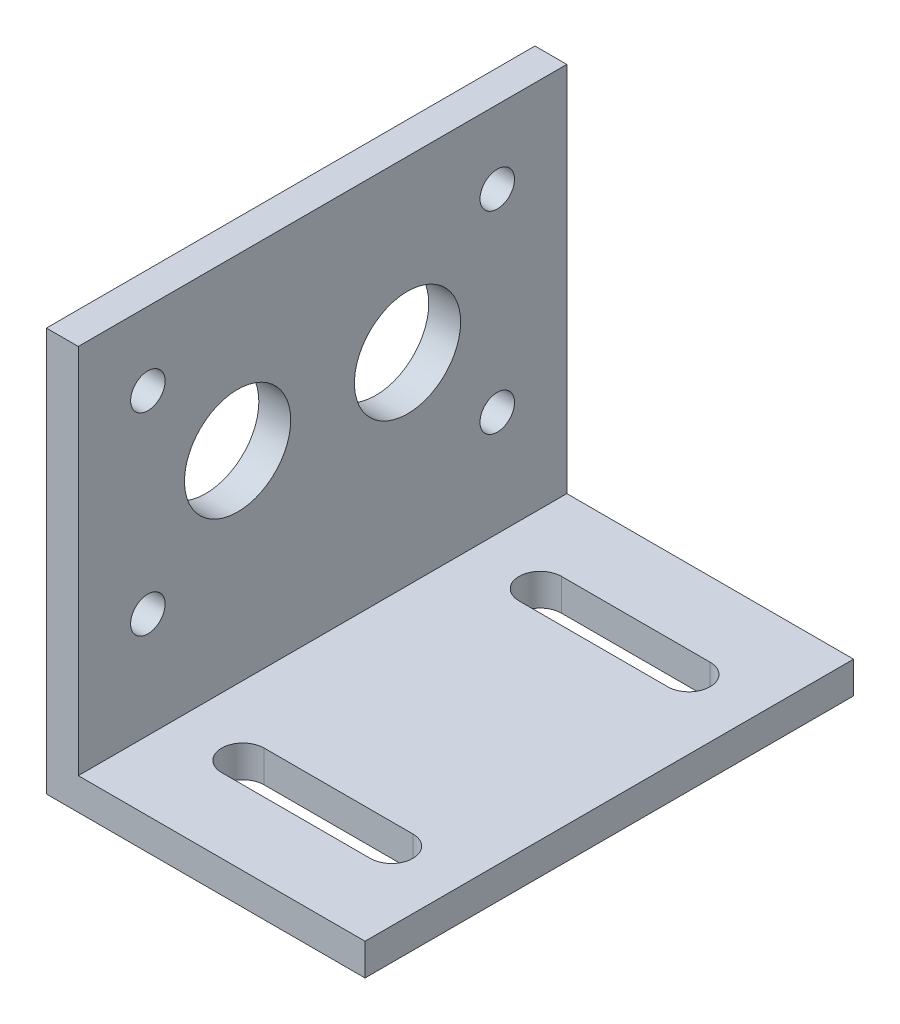
ISO-10303-21;
HEADER;
FILE_DESCRIPTION(('STEP AP214'),'2;1');
FILE_NAME('part.step','',(''),(''),'','','');
FILE_SCHEMA(('AUTOMOTIVE_DESIGN { 1 0 10303 214 1 1 1 1 }'));
ENDSEC;
DATA;
#1=APPLICATION_CONTEXT('core data for automotive mechanical design processes');
#2=APPLICATION_PROTOCOL_DEFINITION('international standard','automotive_design',2000,#1);
#3=PRODUCT_CONTEXT('',#1,'mechanical');
#4=PRODUCT('Part','Part','',(#3));
#5=PRODUCT_RELATED_PRODUCT_CATEGORY('part','',(#4));
#6=PRODUCT_DEFINITION_FORMATION('','',#4);
#7=PRODUCT_DEFINITION_CONTEXT('part definition',#1,'design');
#8=PRODUCT_DEFINITION('design','',#6,#7);
#9=PRODUCT_DEFINITION_SHAPE('','',#8);
#10=(LENGTH_UNIT() NAMED_UNIT(*) SI_UNIT(.MILLI.,.METRE.));
#11=(NAMED_UNIT(*) PLANE_ANGLE_UNIT() SI_UNIT($,.RADIAN.));
#12=(NAMED_UNIT(*) SI_UNIT($,.STERADIAN.) SOLID_ANGLE_UNIT());
#13=UNCERTAINTY_MEASURE_WITH_UNIT(LENGTH_MEASURE(1.E-05),#10,'distance_accuracy_value','');
#14=(GEOMETRIC_REPRESENTATION_CONTEXT(3) GLOBAL_UNCERTAINTY_ASSIGNED_CONTEXT((#13)) GLOBAL_UNIT_ASSIGNED_CONTEXT((#10,
#11,#12)) REPRESENTATION_CONTEXT('',''));
#15=CARTESIAN_POINT('',(0.,0.,0.));
#16=DIRECTION('',(0.,0.,1.));
#17=DIRECTION('',(1.,0.,0.));
#18=AXIS2_PLACEMENT_3D('',#15,#16,#17);
#19=CARTESIAN_POINT('',(-27.,3.,23.));
#20=DIRECTION('',(-1.,0.,0.));
#21=DIRECTION('',(0.,0.,1.));
#22=AXIS2_PLACEMENT_3D('',#19,#20,#21);
#23=PLANE('',#22);
#24=CARTESIAN_POINT('',(-27.,12.91,16.45));
#25=DIRECTION('',(1.,0.,0.));
#26=DIRECTION('',(0.,0.,-1.));
#27=AXIS2_PLACEMENT_3D('',#24,#25,#26);
#28=CIRCLE('',#27,1.625);
#29=CARTESIAN_POINT('',(-27.,12.91,14.825));
#30=VERTEX_POINT('',#29);
#31=EDGE_CURVE('E396',#30,#30,#28,.T.);
#32=ORIENTED_EDGE('',*,*,#31,.F.);
#33=EDGE_LOOP('',(#32));
#34=FACE_BOUND('',#33,.T.);
#35=CARTESIAN_POINT('',(-27.,22.,-8.));
#36=DIRECTION('',(1.,0.,0.));
#37=DIRECTION('',(0.,0.,-1.));
#38=AXIS2_PLACEMENT_3D('',#35,#36,#37);
#39=CIRCLE('',#38,5.);
#40=CARTESIAN_POINT('',(-27.,22.,-13.));
#41=VERTEX_POINT('',#40);
#42=EDGE_CURVE('E402',#41,#41,#39,.T.);
#43=ORIENTED_EDGE('',*,*,#42,.F.);
#44=EDGE_LOOP('',(#43));
#45=FACE_BOUND('',#44,.T.);
#46=CARTESIAN_POINT('',(-27.,31.11,16.45));
#47=DIRECTION('',(1.,0.,0.));
#48=DIRECTION('',(0.,0.,-1.));
#49=AXIS2_PLACEMENT_3D('',#46,#47,#48);
#50=CIRCLE('',#49,1.625);
#51=CARTESIAN_POINT('',(-27.,31.11,14.825));
#52=VERTEX_POINT('',#51);
#53=EDGE_CURVE('E168',#52,#52,#50,.T.);
#54=ORIENTED_EDGE('',*,*,#53,.F.);
#55=EDGE_LOOP('',(#54));
#56=FACE_BOUND('',#55,.T.);
#57=DIRECTION('',(0.,1.,0.));
#58=VECTOR('',#57,1.);
#59=CARTESIAN_POINT('',(-27.,3.,-23.));
#60=LINE('',#59,#58);
#61=CARTESIAN_POINT('',(-27.,3.,-23.));
#62=VERTEX_POINT('',#61);
#63=CARTESIAN_POINT('',(-27.,38.,-23.));
#64=VERTEX_POINT('',#63);
#65=EDGE_CURVE('E234',#62,#64,#60,.T.);
#66=ORIENTED_EDGE('',*,*,#65,.T.);
#67=DIRECTION('',(0.,0.,-1.));
#68=VECTOR('',#67,1.);
#69=CARTESIAN_POINT('',(-27.,38.,23.));
#70=LINE('',#69,#68);
#71=CARTESIAN_POINT('',(-27.,38.,23.));
#72=VERTEX_POINT('',#71);
#73=EDGE_CURVE('E249',#72,#64,#70,.T.);
#74=ORIENTED_EDGE('',*,*,#73,.F.);
#75=DIRECTION('',(0.,1.,0.));
#76=VECTOR('',#75,1.);
#77=CARTESIAN_POINT('',(-27.,3.,23.));
#78=LINE('',#77,#76);
#79=CARTESIAN_POINT('',(-27.,3.,23.));
#80=VERTEX_POINT('',#79);
#81=EDGE_CURVE('E221',#80,#72,#78,.T.);
#82=ORIENTED_EDGE('',*,*,#81,.F.);
#83=DIRECTION('',(0.,0.,-1.));
#84=VECTOR('',#83,1.);
#85=CARTESIAN_POINT('',(-27.,3.,23.));
#86=LINE('',#85,#84);
#87=EDGE_CURVE('E48',#80,#62,#86,.T.);
#88=ORIENTED_EDGE('',*,*,#87,.T.);
#89=EDGE_LOOP('',(#66,#74,#82,#88));
#90=FACE_BOUND('',#89,.T.);
#91=CARTESIAN_POINT('',(-27.,12.91,-16.45));
#92=DIRECTION('',(1.,0.,0.));
#93=DIRECTION('',(0.,0.,-1.));
#94=AXIS2_PLACEMENT_3D('',#91,#92,#93);
#95=CIRCLE('',#94,1.625);
#96=CARTESIAN_POINT('',(-27.,12.91,-18.075));
#97=VERTEX_POINT('',#96);
#98=EDGE_CURVE('E382',#97,#97,#95,.F.);
#99=ORIENTED_EDGE('',*,*,#98,.T.);
#100=EDGE_LOOP('',(#99));
#101=FACE_BOUND('',#100,.T.);
#102=CARTESIAN_POINT('',(-27.,31.11,-16.45));
#103=DIRECTION('',(1.,0.,0.));
#104=DIRECTION('',(0.,0.,-1.));
#105=AXIS2_PLACEMENT_3D('',#102,#103,#104);
#106=CIRCLE('',#105,1.625);
#107=CARTESIAN_POINT('',(-27.,31.11,-18.075));
#108=VERTEX_POINT('',#107);
#109=EDGE_CURVE('E384',#108,#108,#106,.F.);
#110=ORIENTED_EDGE('',*,*,#109,.T.);
#111=EDGE_LOOP('',(#110));
#112=FACE_BOUND('',#111,.T.);
#113=CARTESIAN_POINT('',(-27.,22.,8.));
#114=DIRECTION('',(1.,0.,0.));
#115=DIRECTION('',(0.,0.,-1.));
#116=AXIS2_PLACEMENT_3D('',#113,#114,#115);
#117=CIRCLE('',#116,5.);
#118=CARTESIAN_POINT('',(-27.,22.,3.));
#119=VERTEX_POINT('',#118);
#120=EDGE_CURVE('E390',#119,#119,#117,.F.);
#121=ORIENTED_EDGE('',*,*,#120,.T.);
#122=EDGE_LOOP('',(#121));
#123=FACE_BOUND('',#122,.T.);
#124=ADVANCED_FACE('F40',(#34,#45,#56,#90,#101,#112,#123),#23,.F.);
#125=CARTESIAN_POINT('',(-30.,0.,23.));
#126=DIRECTION('',(1.,0.,0.));
#127=DIRECTION('',(0.,0.,-1.));
#128=AXIS2_PLACEMENT_3D('',#125,#126,#127);
#129=PLANE('',#128);
#130=CARTESIAN_POINT('',(-30.,12.91,16.45));
#131=DIRECTION('',(1.,0.,0.));
#132=DIRECTION('',(0.,0.,-1.));
#133=AXIS2_PLACEMENT_3D('',#130,#131,#132);
#134=CIRCLE('',#133,1.625);
#135=CARTESIAN_POINT('',(-30.,12.91,14.825));
#136=VERTEX_POINT('',#135);
#137=EDGE_CURVE('E393',#136,#136,#134,.T.);
#138=ORIENTED_EDGE('',*,*,#137,.T.);
#139=EDGE_LOOP('',(#138));
#140=FACE_BOUND('',#139,.T.);
#141=CARTESIAN_POINT('',(-30.,22.,-8.));
#142=DIRECTION('',(1.,0.,0.));
#143=DIRECTION('',(0.,0.,-1.));
#144=AXIS2_PLACEMENT_3D('',#141,#142,#143);
#145=CIRCLE('',#144,5.);
#146=CARTESIAN_POINT('',(-30.,22.,-13.));
#147=VERTEX_POINT('',#146);
#148=EDGE_CURVE('E399',#147,#147,#145,.T.);
#149=ORIENTED_EDGE('',*,*,#148,.T.);
#150=EDGE_LOOP('',(#149));
#151=FACE_BOUND('',#150,.T.);
#152=CARTESIAN_POINT('',(-30.,31.11,16.45));
#153=DIRECTION('',(1.,0.,0.));
#154=DIRECTION('',(0.,0.,-1.));
#155=AXIS2_PLACEMENT_3D('',#152,#153,#154);
#156=CIRCLE('',#155,1.625);
#157=CARTESIAN_POINT('',(-30.,31.11,14.825));
#158=VERTEX_POINT('',#157);
#159=EDGE_CURVE('E193',#158,#158,#156,.T.);
#160=ORIENTED_EDGE('',*,*,#159,.T.);
#161=EDGE_LOOP('',(#160));
#162=FACE_BOUND('',#161,.T.);
#163=DIRECTION('',(0.,-1.,0.));
#164=VECTOR('',#163,1.);
#165=CARTESIAN_POINT('',(-30.,0.,-23.));
#166=LINE('',#165,#164);
#167=CARTESIAN_POINT('',(-30.,38.,-23.));
#168=VERTEX_POINT('',#167);
#169=CARTESIAN_POINT('',(-30.,0.,-23.));
#170=VERTEX_POINT('',#169);
#171=EDGE_CURVE('E238',#168,#170,#166,.T.);
#172=ORIENTED_EDGE('',*,*,#171,.T.);
#173=DIRECTION('',(0.,0.,-1.));
#174=VECTOR('',#173,1.);
#175=CARTESIAN_POINT('',(-30.,0.,23.));
#176=LINE('',#175,#174);
#177=CARTESIAN_POINT('',(-30.,0.,23.));
#178=VERTEX_POINT('',#177);
#179=EDGE_CURVE('E243',#178,#170,#176,.T.);
#180=ORIENTED_EDGE('',*,*,#179,.F.);
#181=DIRECTION('',(0.,-1.,0.));
#182=VECTOR('',#181,1.);
#183=CARTESIAN_POINT('',(-30.,0.,23.));
#184=LINE('',#183,#182);
#185=CARTESIAN_POINT('',(-30.,38.,23.));
#186=VERTEX_POINT('',#185);
#187=EDGE_CURVE('E225',#186,#178,#184,.T.);
#188=ORIENTED_EDGE('',*,*,#187,.F.);
#189=DIRECTION('',(0.,0.,-1.));
#190=VECTOR('',#189,1.);
#191=CARTESIAN_POINT('',(-30.,38.,23.));
#192=LINE('',#191,#190);
#193=EDGE_CURVE('E246',#186,#168,#192,.T.);
#194=ORIENTED_EDGE('',*,*,#193,.T.);
#195=EDGE_LOOP('',(#172,#180,#188,#194));
#196=FACE_BOUND('',#195,.T.);
#197=CARTESIAN_POINT('',(-30.,12.91,-16.45));
#198=DIRECTION('',(1.,0.,0.));
#199=DIRECTION('',(0.,0.,-1.));
#200=AXIS2_PLACEMENT_3D('',#197,#198,#199);
#201=CIRCLE('',#200,1.625);
#202=CARTESIAN_POINT('',(-30.,12.91,-18.075));
#203=VERTEX_POINT('',#202);
#204=EDGE_CURVE('E379',#203,#203,#201,.F.);
#205=ORIENTED_EDGE('',*,*,#204,.F.);
#206=EDGE_LOOP('',(#205));
#207=FACE_BOUND('',#206,.T.);
#208=CARTESIAN_POINT('',(-30.,31.11,-16.45));
#209=DIRECTION('',(1.,0.,0.));
#210=DIRECTION('',(0.,0.,-1.));
#211=AXIS2_PLACEMENT_3D('',#208,#209,#210);
#212=CIRCLE('',#211,1.625);
#213=CARTESIAN_POINT('',(-30.,31.11,-18.075));
#214=VERTEX_POINT('',#213);
#215=EDGE_CURVE('E405',#214,#214,#212,.F.);
#216=ORIENTED_EDGE('',*,*,#215,.F.);
#217=EDGE_LOOP('',(#216));
#218=FACE_BOUND('',#217,.T.);
#219=CARTESIAN_POINT('',(-30.,22.,8.));
#220=DIRECTION('',(1.,0.,0.));
#221=DIRECTION('',(0.,0.,-1.));
#222=AXIS2_PLACEMENT_3D('',#219,#220,#221);
#223=CIRCLE('',#222,5.);
#224=CARTESIAN_POINT('',(-30.,22.,3.));
#225=VERTEX_POINT('',#224);
#226=EDGE_CURVE('E387',#225,#225,#223,.F.);
#227=ORIENTED_EDGE('',*,*,#226,.F.);
#228=EDGE_LOOP('',(#227));
#229=FACE_BOUND('',#228,.T.);
#230=ADVANCED_FACE('F271',(#140,#151,#162,#196,#207,#218,#229),#129,.F.);
#231=CARTESIAN_POINT('',(0.,0.,23.));
#232=DIRECTION('',(-1.,0.,0.));
#233=DIRECTION('',(0.,0.,1.));
#234=AXIS2_PLACEMENT_3D('',#231,#232,#233);
#235=PLANE('',#234);
#236=DIRECTION('',(0.,1.,0.));
#237=VECTOR('',#236,1.);
#238=CARTESIAN_POINT('',(0.,0.,-23.));
#239=LINE('',#238,#237);
#240=CARTESIAN_POINT('',(0.,0.,-23.));
#241=VERTEX_POINT('',#240);
#242=CARTESIAN_POINT('',(0.,3.,-23.));
#243=VERTEX_POINT('',#242);
#244=EDGE_CURVE('E180',#241,#243,#239,.T.);
#245=ORIENTED_EDGE('',*,*,#244,.T.);
#246=DIRECTION('',(0.,0.,-1.));
#247=VECTOR('',#246,1.);
#248=CARTESIAN_POINT('',(0.,3.,23.));
#249=LINE('',#248,#247);
#250=CARTESIAN_POINT('',(0.,3.,23.));
#251=VERTEX_POINT('',#250);
#252=EDGE_CURVE('E11',#251,#243,#249,.T.);
#253=ORIENTED_EDGE('',*,*,#252,.F.);
#254=DIRECTION('',(0.,1.,0.));
#255=VECTOR('',#254,1.);
#256=CARTESIAN_POINT('',(0.,0.,23.));
#257=LINE('',#256,#255);
#258=CARTESIAN_POINT('',(0.,0.,23.));
#259=VERTEX_POINT('',#258);
#260=EDGE_CURVE('E215',#259,#251,#257,.T.);
#261=ORIENTED_EDGE('',*,*,#260,.F.);
#262=DIRECTION('',(0.,0.,-1.));
#263=VECTOR('',#262,1.);
#264=CARTESIAN_POINT('',(0.,0.,23.));
#265=LINE('',#264,#263);
#266=EDGE_CURVE('E229',#259,#241,#265,.T.);
#267=ORIENTED_EDGE('',*,*,#266,.T.);
#268=EDGE_LOOP('',(#245,#253,#261,#267));
#269=FACE_BOUND('',#268,.T.);
#270=ADVANCED_FACE('F42',(#269),#235,.F.);
#271=CARTESIAN_POINT('',(0.,3.,23.));
#272=DIRECTION('',(0.,-1.,0.));
#273=DIRECTION('',(0.,0.,-1.));
#274=AXIS2_PLACEMENT_3D('',#271,#272,#273);
#275=PLANE('',#274);
#276=DIRECTION('',(-1.,0.,0.));
#277=VECTOR('',#276,1.);
#278=CARTESIAN_POINT('',(-6.5,3.,12.));
#279=LINE('',#278,#277);
#280=CARTESIAN_POINT('',(-6.5,3.,12.));
#281=VERTEX_POINT('',#280);
#282=CARTESIAN_POINT('',(-20.5,3.,12.));
#283=VERTEX_POINT('',#282);
#284=EDGE_CURVE('E174',#281,#283,#279,.T.);
#285=ORIENTED_EDGE('',*,*,#284,.F.);
#286=CARTESIAN_POINT('',(-6.5,3.,14.));
#287=DIRECTION('',(0.,1.,0.));
#288=DIRECTION('',(0.,0.,1.));
#289=AXIS2_PLACEMENT_3D('',#286,#287,#288);
#290=CIRCLE('',#289,2.);
#291=CARTESIAN_POINT('',(-6.5,3.,16.));
#292=VERTEX_POINT('',#291);
#293=EDGE_CURVE('E55',#292,#281,#290,.T.);
#294=ORIENTED_EDGE('',*,*,#293,.F.);
#295=DIRECTION('',(1.,0.,0.));
#296=VECTOR('',#295,1.);
#297=CARTESIAN_POINT('',(-6.5,3.,16.));
#298=LINE('',#297,#296);
#299=CARTESIAN_POINT('',(-20.5,3.,16.));
#300=VERTEX_POINT('',#299);
#301=EDGE_CURVE('E162',#300,#292,#298,.T.);
#302=ORIENTED_EDGE('',*,*,#301,.F.);
#303=CARTESIAN_POINT('',(-20.5,3.,14.));
#304=DIRECTION('',(0.,1.,0.));
#305=DIRECTION('',(0.,0.,1.));
#306=AXIS2_PLACEMENT_3D('',#303,#304,#305);
#307=CIRCLE('',#306,2.);
#308=EDGE_CURVE('E165',#283,#300,#307,.T.);
#309=ORIENTED_EDGE('',*,*,#308,.F.);
#310=EDGE_LOOP('',(#285,#294,#302,#309));
#311=FACE_BOUND('',#310,.T.);
#312=DIRECTION('',(-1.,0.,0.));
#313=VECTOR('',#312,1.);
#314=CARTESIAN_POINT('',(-6.5,3.,-16.));
#315=LINE('',#314,#313);
#316=CARTESIAN_POINT('',(-6.5,3.,-16.));
#317=VERTEX_POINT('',#316);
#318=CARTESIAN_POINT('',(-20.5,3.,-16.));
#319=VERTEX_POINT('',#318);
#320=EDGE_CURVE('E201',#317,#319,#315,.T.);
#321=ORIENTED_EDGE('',*,*,#320,.F.);
#322=CARTESIAN_POINT('',(-6.5,3.,-14.));
#323=DIRECTION('',(0.,1.,0.));
#324=DIRECTION('',(0.,0.,-1.));
#325=AXIS2_PLACEMENT_3D('',#322,#323,#324);
#326=CIRCLE('',#325,2.);
#327=CARTESIAN_POINT('',(-6.5,3.,-12.));
#328=VERTEX_POINT('',#327);
#329=EDGE_CURVE('E63',#328,#317,#326,.T.);
#330=ORIENTED_EDGE('',*,*,#329,.F.);
#331=DIRECTION('',(1.,0.,0.));
#332=VECTOR('',#331,1.);
#333=CARTESIAN_POINT('',(-6.5,3.,-12.));
#334=LINE('',#333,#332);
#335=CARTESIAN_POINT('',(-20.5,3.,-12.));
#336=VERTEX_POINT('',#335);
#337=EDGE_CURVE('E194',#336,#328,#334,.T.);
#338=ORIENTED_EDGE('',*,*,#337,.F.);
#339=CARTESIAN_POINT('',(-20.5,3.,-14.));
#340=DIRECTION('',(0.,1.,0.));
#341=DIRECTION('',(0.,0.,-1.));
#342=AXIS2_PLACEMENT_3D('',#339,#340,#341);
#343=CIRCLE('',#342,2.);
#344=EDGE_CURVE('E197',#319,#336,#343,.T.);
#345=ORIENTED_EDGE('',*,*,#344,.F.);
#346=EDGE_LOOP('',(#321,#330,#338,#345));
#347=FACE_BOUND('',#346,.T.);
#348=DIRECTION('',(-1.,0.,0.));
#349=VECTOR('',#348,1.);
#350=CARTESIAN_POINT('',(0.,3.,-23.));
#351=LINE('',#350,#349);
#352=EDGE_CURVE('E232',#243,#62,#351,.T.);
#353=ORIENTED_EDGE('',*,*,#352,.T.);
#354=ORIENTED_EDGE('',*,*,#87,.F.);
#355=DIRECTION('',(-1.,0.,0.));
#356=VECTOR('',#355,1.);
#357=CARTESIAN_POINT('',(0.,3.,23.));
#358=LINE('',#357,#356);
#359=EDGE_CURVE('E218',#251,#80,#358,.T.);
#360=ORIENTED_EDGE('',*,*,#359,.F.);
#361=ORIENTED_EDGE('',*,*,#252,.T.);
#362=EDGE_LOOP('',(#353,#354,#360,#361));
#363=FACE_BOUND('',#362,.T.);
#364=ADVANCED_FACE('F280',(#311,#347,#363),#275,.F.);
#365=CARTESIAN_POINT('',(-30.,38.,23.));
#366=DIRECTION('',(0.,-1.,0.));
#367=DIRECTION('',(0.,0.,-1.));
#368=AXIS2_PLACEMENT_3D('',#365,#366,#367);
#369=PLANE('',#368);
#370=DIRECTION('',(-1.,0.,0.));
#371=VECTOR('',#370,1.);
#372=CARTESIAN_POINT('',(-30.,38.,-23.));
#373=LINE('',#372,#371);
#374=EDGE_CURVE('E236',#64,#168,#373,.T.);
#375=ORIENTED_EDGE('',*,*,#374,.T.);
#376=ORIENTED_EDGE('',*,*,#193,.F.);
#377=DIRECTION('',(-1.,0.,0.));
#378=VECTOR('',#377,1.);
#379=CARTESIAN_POINT('',(-30.,38.,23.));
#380=LINE('',#379,#378);
#381=EDGE_CURVE('E223',#72,#186,#380,.T.);
#382=ORIENTED_EDGE('',*,*,#381,.F.);
#383=ORIENTED_EDGE('',*,*,#73,.T.);
#384=EDGE_LOOP('',(#375,#376,#382,#383));
#385=FACE_BOUND('',#384,.T.);
#386=ADVANCED_FACE('F267',(#385),#369,.F.);
#387=CARTESIAN_POINT('',(0.,0.,23.));
#388=DIRECTION('',(0.,1.,0.));
#389=DIRECTION('',(0.,0.,1.));
#390=AXIS2_PLACEMENT_3D('',#387,#388,#389);
#391=PLANE('',#390);
#392=DIRECTION('',(1.,0.,0.));
#393=VECTOR('',#392,1.);
#394=CARTESIAN_POINT('',(-6.5,0.,16.));
#395=LINE('',#394,#393);
#396=CARTESIAN_POINT('',(-20.5,0.,16.));
#397=VERTEX_POINT('',#396);
#398=CARTESIAN_POINT('',(-6.5,0.,16.));
#399=VERTEX_POINT('',#398);
#400=EDGE_CURVE('E149',#397,#399,#395,.T.);
#401=ORIENTED_EDGE('',*,*,#400,.T.);
#402=CARTESIAN_POINT('',(-6.5,0.,14.));
#403=DIRECTION('',(0.,1.,0.));
#404=DIRECTION('',(0.,0.,1.));
#405=AXIS2_PLACEMENT_3D('',#402,#403,#404);
#406=CIRCLE('',#405,2.);
#407=CARTESIAN_POINT('',(-6.5,0.,12.));
#408=VERTEX_POINT('',#407);
#409=EDGE_CURVE('E143',#399,#408,#406,.T.);
#410=ORIENTED_EDGE('',*,*,#409,.T.);
#411=DIRECTION('',(-1.,0.,0.));
#412=VECTOR('',#411,1.);
#413=CARTESIAN_POINT('',(-6.5,0.,12.));
#414=LINE('',#413,#412);
#415=CARTESIAN_POINT('',(-20.5,0.,12.));
#416=VERTEX_POINT('',#415);
#417=EDGE_CURVE('E153',#408,#416,#414,.T.);
#418=ORIENTED_EDGE('',*,*,#417,.T.);
#419=CARTESIAN_POINT('',(-20.5,0.,14.));
#420=DIRECTION('',(0.,1.,0.));
#421=DIRECTION('',(0.,0.,1.));
#422=AXIS2_PLACEMENT_3D('',#419,#420,#421);
#423=CIRCLE('',#422,2.);
#424=EDGE_CURVE('E157',#416,#397,#423,.T.);
#425=ORIENTED_EDGE('',*,*,#424,.T.);
#426=EDGE_LOOP('',(#401,#410,#418,#425));
#427=FACE_BOUND('',#426,.T.);
#428=DIRECTION('',(1.,0.,0.));
#429=VECTOR('',#428,1.);
#430=CARTESIAN_POINT('',(-6.5,0.,-12.));
#431=LINE('',#430,#429);
#432=CARTESIAN_POINT('',(-20.5,0.,-12.));
#433=VERTEX_POINT('',#432);
#434=CARTESIAN_POINT('',(-6.5,0.,-12.));
#435=VERTEX_POINT('',#434);
#436=EDGE_CURVE('E186',#433,#435,#431,.T.);
#437=ORIENTED_EDGE('',*,*,#436,.T.);
#438=CARTESIAN_POINT('',(-6.5,0.,-14.));
#439=DIRECTION('',(0.,1.,0.));
#440=DIRECTION('',(0.,0.,-1.));
#441=AXIS2_PLACEMENT_3D('',#438,#439,#440);
#442=CIRCLE('',#441,2.);
#443=CARTESIAN_POINT('',(-6.5,0.,-16.));
#444=VERTEX_POINT('',#443);
#445=EDGE_CURVE('E198',#435,#444,#442,.T.);
#446=ORIENTED_EDGE('',*,*,#445,.T.);
#447=DIRECTION('',(-1.,0.,0.));
#448=VECTOR('',#447,1.);
#449=CARTESIAN_POINT('',(-6.5,0.,-16.));
#450=LINE('',#449,#448);
#451=CARTESIAN_POINT('',(-20.5,0.,-16.));
#452=VERTEX_POINT('',#451);
#453=EDGE_CURVE('E210',#444,#452,#450,.T.);
#454=ORIENTED_EDGE('',*,*,#453,.T.);
#455=CARTESIAN_POINT('',(-20.5,0.,-14.));
#456=DIRECTION('',(0.,1.,0.));
#457=DIRECTION('',(0.,0.,-1.));
#458=AXIS2_PLACEMENT_3D('',#455,#456,#457);
#459=CIRCLE('',#458,2.);
#460=EDGE_CURVE('E207',#452,#433,#459,.T.);
#461=ORIENTED_EDGE('',*,*,#460,.T.);
#462=EDGE_LOOP('',(#437,#446,#454,#461));
#463=FACE_BOUND('',#462,.T.);
#464=DIRECTION('',(1.,0.,0.));
#465=VECTOR('',#464,1.);
#466=CARTESIAN_POINT('',(0.,0.,-23.));
#467=LINE('',#466,#465);
#468=EDGE_CURVE('E219',#170,#241,#467,.T.);
#469=ORIENTED_EDGE('',*,*,#468,.T.);
#470=ORIENTED_EDGE('',*,*,#266,.F.);
#471=DIRECTION('',(1.,0.,0.));
#472=VECTOR('',#471,1.);
#473=CARTESIAN_POINT('',(0.,0.,23.));
#474=LINE('',#473,#472);
#475=EDGE_CURVE('E227',#178,#259,#474,.T.);
#476=ORIENTED_EDGE('',*,*,#475,.F.);
#477=ORIENTED_EDGE('',*,*,#179,.T.);
#478=EDGE_LOOP('',(#469,#470,#476,#477));
#479=FACE_BOUND('',#478,.T.);
#480=ADVANCED_FACE('F159',(#427,#463,#479),#391,.F.);
#481=CARTESIAN_POINT('',(0.,0.,23.));
#482=DIRECTION('',(0.,0.,1.));
#483=DIRECTION('',(1.,0.,0.));
#484=AXIS2_PLACEMENT_3D('',#481,#482,#483);
#485=PLANE('',#484);
#486=ORIENTED_EDGE('',*,*,#260,.T.);
#487=ORIENTED_EDGE('',*,*,#359,.T.);
#488=ORIENTED_EDGE('',*,*,#81,.T.);
#489=ORIENTED_EDGE('',*,*,#381,.T.);
#490=ORIENTED_EDGE('',*,*,#187,.T.);
#491=ORIENTED_EDGE('',*,*,#475,.T.);
#492=EDGE_LOOP('',(#486,#487,#488,#489,#490,#491));
#493=FACE_BOUND('',#492,.T.);
#494=ADVANCED_FACE('F276',(#493),#485,.T.);
#495=CARTESIAN_POINT('',(0.,0.,-23.));
#496=DIRECTION('',(0.,0.,1.));
#497=DIRECTION('',(1.,0.,0.));
#498=AXIS2_PLACEMENT_3D('',#495,#496,#497);
#499=PLANE('',#498);
#500=ORIENTED_EDGE('',*,*,#244,.F.);
#501=ORIENTED_EDGE('',*,*,#468,.F.);
#502=ORIENTED_EDGE('',*,*,#171,.F.);
#503=ORIENTED_EDGE('',*,*,#374,.F.);
#504=ORIENTED_EDGE('',*,*,#65,.F.);
#505=ORIENTED_EDGE('',*,*,#352,.F.);
#506=EDGE_LOOP('',(#500,#501,#502,#503,#504,#505));
#507=FACE_BOUND('',#506,.T.);
#508=ADVANCED_FACE('F262',(#507),#499,.F.);
#509=CARTESIAN_POINT('',(-6.5,0.,-14.));
#510=DIRECTION('',(0.,1.,0.));
#511=DIRECTION('',(0.,0.,1.));
#512=AXIS2_PLACEMENT_3D('',#509,#510,#511);
#513=CYLINDRICAL_SURFACE('',#512,2.);
#514=ORIENTED_EDGE('',*,*,#329,.T.);
#515=DIRECTION('',(0.,1.,0.));
#516=VECTOR('',#515,1.);
#517=CARTESIAN_POINT('',(-6.5,0.,-16.));
#518=LINE('',#517,#516);
#519=EDGE_CURVE('E184',#444,#317,#518,.T.);
#520=ORIENTED_EDGE('',*,*,#519,.F.);
#521=ORIENTED_EDGE('',*,*,#445,.F.);
#522=DIRECTION('',(0.,1.,0.));
#523=VECTOR('',#522,1.);
#524=CARTESIAN_POINT('',(-6.5,0.,-12.));
#525=LINE('',#524,#523);
#526=EDGE_CURVE('E191',#435,#328,#525,.T.);
#527=ORIENTED_EDGE('',*,*,#526,.T.);
#528=EDGE_LOOP('',(#514,#520,#521,#527));
#529=FACE_BOUND('',#528,.T.);
#530=ADVANCED_FACE('F317',(#529),#513,.F.);
#531=CARTESIAN_POINT('',(-6.5,0.,-12.));
#532=DIRECTION('',(0.,0.,1.));
#533=DIRECTION('',(1.,0.,0.));
#534=AXIS2_PLACEMENT_3D('',#531,#532,#533);
#535=PLANE('',#534);
#536=ORIENTED_EDGE('',*,*,#337,.T.);
#537=ORIENTED_EDGE('',*,*,#526,.F.);
#538=ORIENTED_EDGE('',*,*,#436,.F.);
#539=DIRECTION('',(0.,1.,0.));
#540=VECTOR('',#539,1.);
#541=CARTESIAN_POINT('',(-20.5,0.,-12.));
#542=LINE('',#541,#540);
#543=EDGE_CURVE('E189',#433,#336,#542,.T.);
#544=ORIENTED_EDGE('',*,*,#543,.T.);
#545=EDGE_LOOP('',(#536,#537,#538,#544));
#546=FACE_BOUND('',#545,.T.);
#547=ADVANCED_FACE('F320',(#546),#535,.F.);
#548=CARTESIAN_POINT('',(-20.5,0.,-14.));
#549=DIRECTION('',(0.,1.,0.));
#550=DIRECTION('',(0.,0.,1.));
#551=AXIS2_PLACEMENT_3D('',#548,#549,#550);
#552=CYLINDRICAL_SURFACE('',#551,2.);
#553=ORIENTED_EDGE('',*,*,#344,.T.);
#554=ORIENTED_EDGE('',*,*,#543,.F.);
#555=ORIENTED_EDGE('',*,*,#460,.F.);
#556=DIRECTION('',(0.,1.,0.));
#557=VECTOR('',#556,1.);
#558=CARTESIAN_POINT('',(-20.5,0.,-16.));
#559=LINE('',#558,#557);
#560=EDGE_CURVE('E187',#452,#319,#559,.T.);
#561=ORIENTED_EDGE('',*,*,#560,.T.);
#562=EDGE_LOOP('',(#553,#554,#555,#561));
#563=FACE_BOUND('',#562,.T.);
#564=ADVANCED_FACE('F322',(#563),#552,.F.);
#565=CARTESIAN_POINT('',(-6.5,0.,-16.));
#566=DIRECTION('',(0.,0.,-1.));
#567=DIRECTION('',(-1.,0.,0.));
#568=AXIS2_PLACEMENT_3D('',#565,#566,#567);
#569=PLANE('',#568);
#570=ORIENTED_EDGE('',*,*,#320,.T.);
#571=ORIENTED_EDGE('',*,*,#560,.F.);
#572=ORIENTED_EDGE('',*,*,#453,.F.);
#573=ORIENTED_EDGE('',*,*,#519,.T.);
#574=EDGE_LOOP('',(#570,#571,#572,#573));
#575=FACE_BOUND('',#574,.T.);
#576=ADVANCED_FACE('F314',(#575),#569,.F.);
#577=CARTESIAN_POINT('',(-6.5,0.,14.));
#578=DIRECTION('',(0.,1.,0.));
#579=DIRECTION('',(0.,0.,1.));
#580=AXIS2_PLACEMENT_3D('',#577,#578,#579);
#581=CYLINDRICAL_SURFACE('',#580,2.);
#582=ORIENTED_EDGE('',*,*,#293,.T.);
#583=DIRECTION('',(0.,1.,0.));
#584=VECTOR('',#583,1.);
#585=CARTESIAN_POINT('',(-6.5,0.,12.));
#586=LINE('',#585,#584);
#587=EDGE_CURVE('E139',#408,#281,#586,.T.);
#588=ORIENTED_EDGE('',*,*,#587,.F.);
#589=ORIENTED_EDGE('',*,*,#409,.F.);
#590=DIRECTION('',(0.,1.,0.));
#591=VECTOR('',#590,1.);
#592=CARTESIAN_POINT('',(-6.5,0.,16.));
#593=LINE('',#592,#591);
#594=EDGE_CURVE('E178',#399,#292,#593,.T.);
#595=ORIENTED_EDGE('',*,*,#594,.T.);
#596=EDGE_LOOP('',(#582,#588,#589,#595));
#597=FACE_BOUND('',#596,.T.);
#598=ADVANCED_FACE('F141',(#597),#581,.F.);
#599=CARTESIAN_POINT('',(-6.5,0.,16.));
#600=DIRECTION('',(0.,0.,1.));
#601=DIRECTION('',(1.,0.,0.));
#602=AXIS2_PLACEMENT_3D('',#599,#600,#601);
#603=PLANE('',#602);
#604=ORIENTED_EDGE('',*,*,#301,.T.);
#605=ORIENTED_EDGE('',*,*,#594,.F.);
#606=ORIENTED_EDGE('',*,*,#400,.F.);
#607=DIRECTION('',(0.,1.,0.));
#608=VECTOR('',#607,1.);
#609=CARTESIAN_POINT('',(-20.5,0.,16.));
#610=LINE('',#609,#608);
#611=EDGE_CURVE('E181',#397,#300,#610,.T.);
#612=ORIENTED_EDGE('',*,*,#611,.T.);
#613=EDGE_LOOP('',(#604,#605,#606,#612));
#614=FACE_BOUND('',#613,.T.);
#615=ADVANCED_FACE('F341',(#614),#603,.F.);
#616=CARTESIAN_POINT('',(-20.5,0.,14.));
#617=DIRECTION('',(0.,1.,0.));
#618=DIRECTION('',(0.,0.,1.));
#619=AXIS2_PLACEMENT_3D('',#616,#617,#618);
#620=CYLINDRICAL_SURFACE('',#619,2.);
#621=ORIENTED_EDGE('',*,*,#308,.T.);
#622=ORIENTED_EDGE('',*,*,#611,.F.);
#623=ORIENTED_EDGE('',*,*,#424,.F.);
#624=DIRECTION('',(0.,1.,0.));
#625=VECTOR('',#624,1.);
#626=CARTESIAN_POINT('',(-20.5,0.,12.));
#627=LINE('',#626,#625);
#628=EDGE_CURVE('E148',#416,#283,#627,.T.);
#629=ORIENTED_EDGE('',*,*,#628,.T.);
#630=EDGE_LOOP('',(#621,#622,#623,#629));
#631=FACE_BOUND('',#630,.T.);
#632=ADVANCED_FACE('F345',(#631),#620,.F.);
#633=CARTESIAN_POINT('',(-6.5,0.,12.));
#634=DIRECTION('',(0.,0.,-1.));
#635=DIRECTION('',(-1.,0.,0.));
#636=AXIS2_PLACEMENT_3D('',#633,#634,#635);
#637=PLANE('',#636);
#638=ORIENTED_EDGE('',*,*,#284,.T.);
#639=ORIENTED_EDGE('',*,*,#628,.F.);
#640=ORIENTED_EDGE('',*,*,#417,.F.);
#641=ORIENTED_EDGE('',*,*,#587,.T.);
#642=EDGE_LOOP('',(#638,#639,#640,#641));
#643=FACE_BOUND('',#642,.T.);
#644=ADVANCED_FACE('F154',(#643),#637,.F.);
#645=CARTESIAN_POINT('',(-30.,31.11,16.45));
#646=DIRECTION('',(1.,0.,0.));
#647=DIRECTION('',(0.,0.,-1.));
#648=AXIS2_PLACEMENT_3D('',#645,#646,#647);
#649=CYLINDRICAL_SURFACE('',#648,1.625);
#650=ORIENTED_EDGE('',*,*,#159,.F.);
#651=EDGE_LOOP('',(#650));
#652=FACE_BOUND('',#651,.T.);
#653=ORIENTED_EDGE('',*,*,#53,.T.);
#654=EDGE_LOOP('',(#653));
#655=FACE_BOUND('',#654,.T.);
#656=ADVANCED_FACE('F344',(#652,#655),#649,.F.);
#657=CARTESIAN_POINT('',(-30.,12.91,-16.45));
#658=DIRECTION('',(1.,0.,0.));
#659=DIRECTION('',(0.,0.,-1.));
#660=AXIS2_PLACEMENT_3D('',#657,#658,#659);
#661=CYLINDRICAL_SURFACE('',#660,1.625);
#662=ORIENTED_EDGE('',*,*,#204,.T.);
#663=EDGE_LOOP('',(#662));
#664=FACE_BOUND('',#663,.T.);
#665=ORIENTED_EDGE('',*,*,#98,.F.);
#666=EDGE_LOOP('',(#665));
#667=FACE_BOUND('',#666,.T.);
#668=ADVANCED_FACE('F354',(#664,#667),#661,.F.);
#669=CARTESIAN_POINT('',(-30.,31.11,-16.45));
#670=DIRECTION('',(1.,0.,0.));
#671=DIRECTION('',(0.,0.,-1.));
#672=AXIS2_PLACEMENT_3D('',#669,#670,#671);
#673=CYLINDRICAL_SURFACE('',#672,1.625);
#674=ORIENTED_EDGE('',*,*,#215,.T.);
#675=EDGE_LOOP('',(#674));
#676=FACE_BOUND('',#675,.T.);
#677=ORIENTED_EDGE('',*,*,#109,.F.);
#678=EDGE_LOOP('',(#677));
#679=FACE_BOUND('',#678,.T.);
#680=ADVANCED_FACE('F356',(#676,#679),#673,.F.);
#681=CARTESIAN_POINT('',(-30.,22.,-8.));
#682=DIRECTION('',(1.,0.,0.));
#683=DIRECTION('',(0.,0.,-1.));
#684=AXIS2_PLACEMENT_3D('',#681,#682,#683);
#685=CYLINDRICAL_SURFACE('',#684,5.);
#686=ORIENTED_EDGE('',*,*,#148,.F.);
#687=EDGE_LOOP('',(#686));
#688=FACE_BOUND('',#687,.T.);
#689=ORIENTED_EDGE('',*,*,#42,.T.);
#690=EDGE_LOOP('',(#689));
#691=FACE_BOUND('',#690,.T.);
#692=ADVANCED_FACE('F359',(#688,#691),#685,.F.);
#693=CARTESIAN_POINT('',(-30.,12.91,16.45));
#694=DIRECTION('',(1.,0.,0.));
#695=DIRECTION('',(0.,0.,-1.));
#696=AXIS2_PLACEMENT_3D('',#693,#694,#695);
#697=CYLINDRICAL_SURFACE('',#696,1.625);
#698=ORIENTED_EDGE('',*,*,#137,.F.);
#699=EDGE_LOOP('',(#698));
#700=FACE_BOUND('',#699,.T.);
#701=ORIENTED_EDGE('',*,*,#31,.T.);
#702=EDGE_LOOP('',(#701));
#703=FACE_BOUND('',#702,.T.);
#704=ADVANCED_FACE('F363',(#700,#703),#697,.F.);
#705=CARTESIAN_POINT('',(-30.,22.,8.));
#706=DIRECTION('',(1.,0.,0.));
#707=DIRECTION('',(0.,0.,-1.));
#708=AXIS2_PLACEMENT_3D('',#705,#706,#707);
#709=CYLINDRICAL_SURFACE('',#708,5.);
#710=ORIENTED_EDGE('',*,*,#226,.T.);
#711=EDGE_LOOP('',(#710));
#712=FACE_BOUND('',#711,.T.);
#713=ORIENTED_EDGE('',*,*,#120,.F.);
#714=EDGE_LOOP('',(#713));
#715=FACE_BOUND('',#714,.T.);
#716=ADVANCED_FACE('F367',(#712,#715),#709,.F.);
#717=CLOSED_SHELL('',(#124,#230,#270,#364,#386,#480,#494,#508,#530,#547,#564,#576,#598,#615,
#632,#644,#656,#668,#680,#692,#704,#716));
#718=MANIFOLD_SOLID_BREP('B2',#717);
#719=ADVANCED_BREP_SHAPE_REPRESENTATION('',(#18,#718),#14);
#720=SHAPE_DEFINITION_REPRESENTATION(#9,#719);
ENDSEC;
END-ISO-10303-21;
